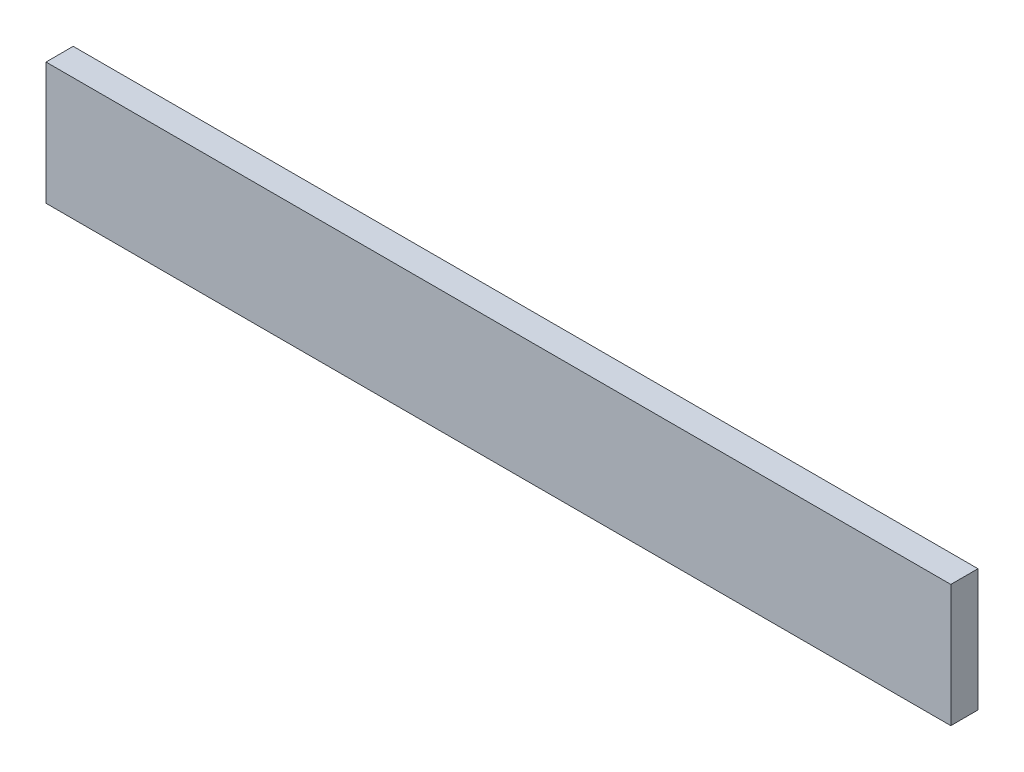
ISO-10303-21;
HEADER;
FILE_DESCRIPTION(('STEP AP214'),'2;1');
FILE_NAME('part.step','',(''),(''),'','','');
FILE_SCHEMA(('AUTOMOTIVE_DESIGN { 1 0 10303 214 1 1 1 1 }'));
ENDSEC;
DATA;
#1=APPLICATION_CONTEXT('core data for automotive mechanical design processes');
#2=APPLICATION_PROTOCOL_DEFINITION('international standard','automotive_design',2000,#1);
#3=PRODUCT_CONTEXT('',#1,'mechanical');
#4=PRODUCT('Part','Part','',(#3));
#5=PRODUCT_RELATED_PRODUCT_CATEGORY('part','',(#4));
#6=PRODUCT_DEFINITION_FORMATION('','',#4);
#7=PRODUCT_DEFINITION_CONTEXT('part definition',#1,'design');
#8=PRODUCT_DEFINITION('design','',#6,#7);
#9=PRODUCT_DEFINITION_SHAPE('','',#8);
#10=(LENGTH_UNIT() NAMED_UNIT(*) SI_UNIT(.MILLI.,.METRE.));
#11=(NAMED_UNIT(*) PLANE_ANGLE_UNIT() SI_UNIT($,.RADIAN.));
#12=(NAMED_UNIT(*) SI_UNIT($,.STERADIAN.) SOLID_ANGLE_UNIT());
#13=UNCERTAINTY_MEASURE_WITH_UNIT(LENGTH_MEASURE(1.E-05),#10,'distance_accuracy_value','');
#14=(GEOMETRIC_REPRESENTATION_CONTEXT(3) GLOBAL_UNCERTAINTY_ASSIGNED_CONTEXT((#13)) GLOBAL_UNIT_ASSIGNED_CONTEXT((#10,
#11,#12)) REPRESENTATION_CONTEXT('',''));
#15=CARTESIAN_POINT('',(0.,0.,0.));
#16=DIRECTION('',(0.,0.,1.));
#17=DIRECTION('',(1.,0.,0.));
#18=AXIS2_PLACEMENT_3D('',#15,#16,#17);
#19=CARTESIAN_POINT('',(0.,-5.,10.));
#20=DIRECTION('',(0.,-1.,0.));
#21=DIRECTION('',(1.,0.,0.));
#22=AXIS2_PLACEMENT_3D('',#19,#20,#21);
#23=PLANE('',#22);
#24=DIRECTION('',(-1.,0.,0.));
#25=VECTOR('',#24,1.);
#26=CARTESIAN_POINT('',(0.,-5.,0.));
#27=LINE('',#26,#25);
#28=CARTESIAN_POINT('',(166.4,-4.99999999999997,0.));
#29=VERTEX_POINT('',#28);
#30=CARTESIAN_POINT('',(-166.400000000001,-5.,0.));
#31=VERTEX_POINT('',#30);
#32=EDGE_CURVE('E75',#29,#31,#27,.T.);
#33=ORIENTED_EDGE('',*,*,#32,.T.);
#34=DIRECTION('',(0.,0.,-1.));
#35=VECTOR('',#34,1.);
#36=CARTESIAN_POINT('',(-166.400000000001,-5.,10.));
#37=LINE('',#36,#35);
#38=CARTESIAN_POINT('',(-166.400000000001,-5.,10.));
#39=VERTEX_POINT('',#38);
#40=EDGE_CURVE('E11',#39,#31,#37,.T.);
#41=ORIENTED_EDGE('',*,*,#40,.F.);
#42=DIRECTION('',(-1.,0.,0.));
#43=VECTOR('',#42,1.);
#44=CARTESIAN_POINT('',(166.4,-4.99999999999997,10.));
#45=LINE('',#44,#43);
#46=CARTESIAN_POINT('',(166.4,-4.99999999999997,10.));
#47=VERTEX_POINT('',#46);
#48=EDGE_CURVE('E80',#47,#39,#45,.T.);
#49=ORIENTED_EDGE('',*,*,#48,.F.);
#50=DIRECTION('',(0.,0.,-1.));
#51=VECTOR('',#50,1.);
#52=CARTESIAN_POINT('',(166.4,-4.99999999999997,10.));
#53=LINE('',#52,#51);
#54=EDGE_CURVE('E95',#47,#29,#53,.T.);
#55=ORIENTED_EDGE('',*,*,#54,.T.);
#56=EDGE_LOOP('',(#33,#41,#49,#55));
#57=FACE_BOUND('',#56,.T.);
#58=ADVANCED_FACE('F35',(#57),#23,.F.);
#59=CARTESIAN_POINT('',(-166.400000000001,-5.,10.));
#60=DIRECTION('',(1.,0.,0.));
#61=DIRECTION('',(0.,0.,-1.));
#62=AXIS2_PLACEMENT_3D('',#59,#60,#61);
#63=PLANE('',#62);
#64=DIRECTION('',(0.,-1.,0.));
#65=VECTOR('',#64,1.);
#66=CARTESIAN_POINT('',(-166.400000000001,-5.,0.));
#67=LINE('',#66,#65);
#68=CARTESIAN_POINT('',(-166.400000000001,-50.,0.));
#69=VERTEX_POINT('',#68);
#70=EDGE_CURVE('E91',#31,#69,#67,.T.);
#71=ORIENTED_EDGE('',*,*,#70,.T.);
#72=DIRECTION('',(0.,0.,-1.));
#73=VECTOR('',#72,1.);
#74=CARTESIAN_POINT('',(-166.400000000001,-50.,10.));
#75=LINE('',#74,#73);
#76=CARTESIAN_POINT('',(-166.400000000001,-50.,10.));
#77=VERTEX_POINT('',#76);
#78=EDGE_CURVE('E43',#77,#69,#75,.T.);
#79=ORIENTED_EDGE('',*,*,#78,.F.);
#80=DIRECTION('',(0.,-1.,0.));
#81=VECTOR('',#80,1.);
#82=CARTESIAN_POINT('',(-166.400000000001,-5.,10.));
#83=LINE('',#82,#81);
#84=EDGE_CURVE('E83',#39,#77,#83,.T.);
#85=ORIENTED_EDGE('',*,*,#84,.F.);
#86=ORIENTED_EDGE('',*,*,#40,.T.);
#87=EDGE_LOOP('',(#71,#79,#85,#86));
#88=FACE_BOUND('',#87,.T.);
#89=ADVANCED_FACE('F90',(#88),#63,.F.);
#90=CARTESIAN_POINT('',(-166.400000000001,-50.,10.));
#91=DIRECTION('',(0.,1.,0.));
#92=DIRECTION('',(0.,0.,1.));
#93=AXIS2_PLACEMENT_3D('',#90,#91,#92);
#94=PLANE('',#93);
#95=DIRECTION('',(1.,0.,0.));
#96=VECTOR('',#95,1.);
#97=CARTESIAN_POINT('',(-166.400000000001,-50.,0.));
#98=LINE('',#97,#96);
#99=CARTESIAN_POINT('',(166.4,-50.,0.));
#100=VERTEX_POINT('',#99);
#101=EDGE_CURVE('E68',#69,#100,#98,.T.);
#102=ORIENTED_EDGE('',*,*,#101,.T.);
#103=DIRECTION('',(0.,0.,-1.));
#104=VECTOR('',#103,1.);
#105=CARTESIAN_POINT('',(166.4,-50.,10.));
#106=LINE('',#105,#104);
#107=CARTESIAN_POINT('',(166.4,-50.,10.));
#108=VERTEX_POINT('',#107);
#109=EDGE_CURVE('E92',#108,#100,#106,.T.);
#110=ORIENTED_EDGE('',*,*,#109,.F.);
#111=DIRECTION('',(1.,0.,0.));
#112=VECTOR('',#111,1.);
#113=CARTESIAN_POINT('',(-166.400000000001,-50.,10.));
#114=LINE('',#113,#112);
#115=EDGE_CURVE('E87',#77,#108,#114,.T.);
#116=ORIENTED_EDGE('',*,*,#115,.F.);
#117=ORIENTED_EDGE('',*,*,#78,.T.);
#118=EDGE_LOOP('',(#102,#110,#116,#117));
#119=FACE_BOUND('',#118,.T.);
#120=ADVANCED_FACE('F93',(#119),#94,.F.);
#121=CARTESIAN_POINT('',(166.4,-50.,10.));
#122=DIRECTION('',(-1.,0.,0.));
#123=DIRECTION('',(0.,-1.,0.));
#124=AXIS2_PLACEMENT_3D('',#121,#122,#123);
#125=PLANE('',#124);
#126=DIRECTION('',(0.,1.,0.));
#127=VECTOR('',#126,1.);
#128=CARTESIAN_POINT('',(166.4,-50.,0.));
#129=LINE('',#128,#127);
#130=EDGE_CURVE('E102',#100,#29,#129,.T.);
#131=ORIENTED_EDGE('',*,*,#130,.T.);
#132=ORIENTED_EDGE('',*,*,#54,.F.);
#133=DIRECTION('',(0.,1.,0.));
#134=VECTOR('',#133,1.);
#135=CARTESIAN_POINT('',(166.4,-50.,10.));
#136=LINE('',#135,#134);
#137=EDGE_CURVE('E51',#108,#47,#136,.T.);
#138=ORIENTED_EDGE('',*,*,#137,.F.);
#139=ORIENTED_EDGE('',*,*,#109,.T.);
#140=EDGE_LOOP('',(#131,#132,#138,#139));
#141=FACE_BOUND('',#140,.T.);
#142=ADVANCED_FACE('F107',(#141),#125,.F.);
#143=CARTESIAN_POINT('',(0.,0.,10.));
#144=DIRECTION('',(0.,0.,1.));
#145=DIRECTION('',(1.,0.,0.));
#146=AXIS2_PLACEMENT_3D('',#143,#144,#145);
#147=PLANE('',#146);
#148=ORIENTED_EDGE('',*,*,#48,.T.);
#149=ORIENTED_EDGE('',*,*,#84,.T.);
#150=ORIENTED_EDGE('',*,*,#115,.T.);
#151=ORIENTED_EDGE('',*,*,#137,.T.);
#152=EDGE_LOOP('',(#148,#149,#150,#151));
#153=FACE_BOUND('',#152,.T.);
#154=ADVANCED_FACE('F85',(#153),#147,.T.);
#155=CARTESIAN_POINT('',(0.,0.,0.));
#156=DIRECTION('',(0.,0.,1.));
#157=DIRECTION('',(1.,0.,0.));
#158=AXIS2_PLACEMENT_3D('',#155,#156,#157);
#159=PLANE('',#158);
#160=ORIENTED_EDGE('',*,*,#32,.F.);
#161=ORIENTED_EDGE('',*,*,#130,.F.);
#162=ORIENTED_EDGE('',*,*,#101,.F.);
#163=ORIENTED_EDGE('',*,*,#70,.F.);
#164=EDGE_LOOP('',(#160,#161,#162,#163));
#165=FACE_BOUND('',#164,.T.);
#166=ADVANCED_FACE('F108',(#165),#159,.F.);
#167=CLOSED_SHELL('',(#58,#89,#120,#142,#154,#166));
#168=MANIFOLD_SOLID_BREP('B2',#167);
#169=ADVANCED_BREP_SHAPE_REPRESENTATION('',(#18,#168),#14);
#170=SHAPE_DEFINITION_REPRESENTATION(#9,#169);
ENDSEC;
END-ISO-10303-21;
